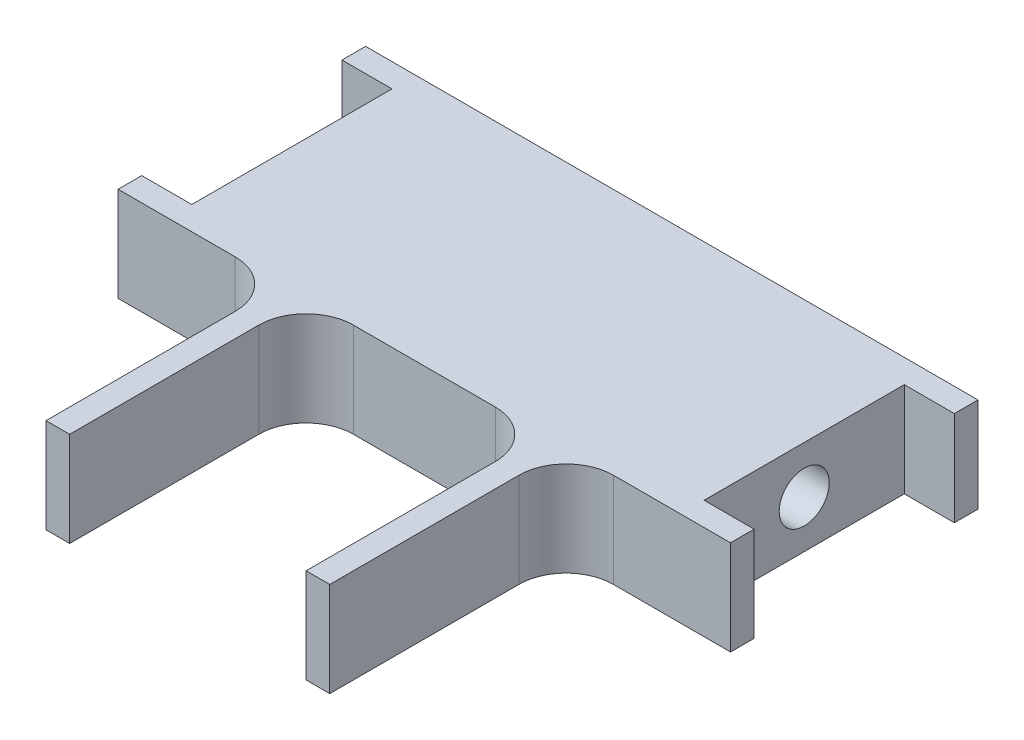
ISO-10303-21;
HEADER;
FILE_DESCRIPTION(('STEP AP214'),'2;1');
FILE_NAME('part.step','',(''),(''),'','','');
FILE_SCHEMA(('AUTOMOTIVE_DESIGN { 1 0 10303 214 1 1 1 1 }'));
ENDSEC;
DATA;
#1=APPLICATION_CONTEXT('core data for automotive mechanical design processes');
#2=APPLICATION_PROTOCOL_DEFINITION('international standard','automotive_design',2000,#1);
#3=PRODUCT_CONTEXT('',#1,'mechanical');
#4=PRODUCT('Part','Part','',(#3));
#5=PRODUCT_RELATED_PRODUCT_CATEGORY('part','',(#4));
#6=PRODUCT_DEFINITION_FORMATION('','',#4);
#7=PRODUCT_DEFINITION_CONTEXT('part definition',#1,'design');
#8=PRODUCT_DEFINITION('design','',#6,#7);
#9=PRODUCT_DEFINITION_SHAPE('','',#8);
#10=(LENGTH_UNIT() NAMED_UNIT(*) SI_UNIT(.MILLI.,.METRE.));
#11=(NAMED_UNIT(*) PLANE_ANGLE_UNIT() SI_UNIT($,.RADIAN.));
#12=(NAMED_UNIT(*) SI_UNIT($,.STERADIAN.) SOLID_ANGLE_UNIT());
#13=UNCERTAINTY_MEASURE_WITH_UNIT(LENGTH_MEASURE(1.E-05),#10,'distance_accuracy_value','');
#14=(GEOMETRIC_REPRESENTATION_CONTEXT(3) GLOBAL_UNCERTAINTY_ASSIGNED_CONTEXT((#13)) GLOBAL_UNIT_ASSIGNED_CONTEXT((#10,
#11,#12)) REPRESENTATION_CONTEXT('',''));
#15=CARTESIAN_POINT('',(0.,0.,0.));
#16=DIRECTION('',(0.,0.,1.));
#17=DIRECTION('',(1.,0.,0.));
#18=AXIS2_PLACEMENT_3D('',#15,#16,#17);
#19=CARTESIAN_POINT('',(77.7,12.,0.));
#20=DIRECTION('',(0.,0.,-1.));
#21=DIRECTION('',(-1.,0.,0.));
#22=AXIS2_PLACEMENT_3D('',#19,#20,#21);
#23=PLANE('',#22);
#24=DIRECTION('',(1.,0.,0.));
#25=VECTOR('',#24,1.);
#26=CARTESIAN_POINT('',(77.7,0.,0.));
#27=LINE('',#26,#25);
#28=CARTESIAN_POINT('',(29.85,0.,0.));
#29=VERTEX_POINT('',#28);
#30=CARTESIAN_POINT('',(47.85,0.,0.));
#31=VERTEX_POINT('',#30);
#32=EDGE_CURVE('E286',#29,#31,#27,.T.);
#33=ORIENTED_EDGE('',*,*,#32,.T.);
#34=DIRECTION('',(0.,-1.,0.));
#35=VECTOR('',#34,1.);
#36=CARTESIAN_POINT('',(47.85,12.,0.));
#37=LINE('',#36,#35);
#38=CARTESIAN_POINT('',(47.85,12.,0.));
#39=VERTEX_POINT('',#38);
#40=EDGE_CURVE('E305',#31,#39,#37,.F.);
#41=ORIENTED_EDGE('',*,*,#40,.T.);
#42=DIRECTION('',(1.,0.,0.));
#43=VECTOR('',#42,1.);
#44=CARTESIAN_POINT('',(77.7,12.,0.));
#45=LINE('',#44,#43);
#46=CARTESIAN_POINT('',(29.85,12.,0.));
#47=VERTEX_POINT('',#46);
#48=EDGE_CURVE('E255',#47,#39,#45,.T.);
#49=ORIENTED_EDGE('',*,*,#48,.F.);
#50=DIRECTION('',(0.,1.,0.));
#51=VECTOR('',#50,1.);
#52=CARTESIAN_POINT('',(29.85,0.,0.));
#53=LINE('',#52,#51);
#54=EDGE_CURVE('E283',#47,#29,#53,.F.);
#55=ORIENTED_EDGE('',*,*,#54,.T.);
#56=EDGE_LOOP('',(#33,#41,#49,#55));
#57=FACE_BOUND('',#56,.T.);
#58=ADVANCED_FACE('F32',(#57),#23,.F.);
#59=CARTESIAN_POINT('',(62.85,12.,0.));
#60=VERTEX_POINT('',#59);
#61=CARTESIAN_POINT('',(77.7,12.,0.));
#62=VERTEX_POINT('',#61);
#63=EDGE_CURVE('E246',#60,#62,#45,.T.);
#64=ORIENTED_EDGE('',*,*,#63,.F.);
#65=DIRECTION('',(0.,1.,0.));
#66=VECTOR('',#65,1.);
#67=CARTESIAN_POINT('',(62.85,0.,0.));
#68=LINE('',#67,#66);
#69=CARTESIAN_POINT('',(62.85,0.,0.));
#70=VERTEX_POINT('',#69);
#71=EDGE_CURVE('E53',#60,#70,#68,.F.);
#72=ORIENTED_EDGE('',*,*,#71,.T.);
#73=CARTESIAN_POINT('',(77.7,0.,0.));
#74=VERTEX_POINT('',#73);
#75=EDGE_CURVE('E238',#70,#74,#27,.T.);
#76=ORIENTED_EDGE('',*,*,#75,.T.);
#77=DIRECTION('',(0.,-1.,0.));
#78=VECTOR('',#77,1.);
#79=CARTESIAN_POINT('',(77.7,12.,0.));
#80=LINE('',#79,#78);
#81=EDGE_CURVE('E281',#62,#74,#80,.T.);
#82=ORIENTED_EDGE('',*,*,#81,.F.);
#83=EDGE_LOOP('',(#64,#72,#76,#82));
#84=FACE_BOUND('',#83,.T.);
#85=ADVANCED_FACE('F364',(#84),#23,.F.);
#86=CARTESIAN_POINT('',(0.,0.,0.));
#87=VERTEX_POINT('',#86);
#88=CARTESIAN_POINT('',(14.85,0.,0.));
#89=VERTEX_POINT('',#88);
#90=EDGE_CURVE('E256',#87,#89,#27,.T.);
#91=ORIENTED_EDGE('',*,*,#90,.T.);
#92=DIRECTION('',(0.,-1.,0.));
#93=VECTOR('',#92,1.);
#94=CARTESIAN_POINT('',(14.85,12.,0.));
#95=LINE('',#94,#93);
#96=CARTESIAN_POINT('',(14.85,12.,0.));
#97=VERTEX_POINT('',#96);
#98=EDGE_CURVE('E280',#89,#97,#95,.F.);
#99=ORIENTED_EDGE('',*,*,#98,.T.);
#100=CARTESIAN_POINT('',(0.,12.,0.));
#101=VERTEX_POINT('',#100);
#102=EDGE_CURVE('E251',#101,#97,#45,.T.);
#103=ORIENTED_EDGE('',*,*,#102,.F.);
#104=DIRECTION('',(0.,-1.,0.));
#105=VECTOR('',#104,1.);
#106=CARTESIAN_POINT('',(0.,12.,0.));
#107=LINE('',#106,#105);
#108=EDGE_CURVE('E339',#101,#87,#107,.T.);
#109=ORIENTED_EDGE('',*,*,#108,.T.);
#110=EDGE_LOOP('',(#91,#99,#103,#109));
#111=FACE_BOUND('',#110,.T.);
#112=ADVANCED_FACE('F336',(#111),#23,.F.);
#113=CARTESIAN_POINT('',(77.7,12.,-3.00000000000001));
#114=DIRECTION('',(-1.,0.,0.));
#115=DIRECTION('',(0.,0.,1.));
#116=AXIS2_PLACEMENT_3D('',#113,#114,#115);
#117=PLANE('',#116);
#118=DIRECTION('',(0.,0.,-1.));
#119=VECTOR('',#118,1.);
#120=CARTESIAN_POINT('',(77.7,0.,-3.00000000000001));
#121=LINE('',#120,#119);
#122=CARTESIAN_POINT('',(77.7,0.,-3.00000000000001));
#123=VERTEX_POINT('',#122);
#124=EDGE_CURVE('E295',#74,#123,#121,.T.);
#125=ORIENTED_EDGE('',*,*,#124,.T.);
#126=DIRECTION('',(0.,-1.,0.));
#127=VECTOR('',#126,1.);
#128=CARTESIAN_POINT('',(77.7,12.,-3.00000000000001));
#129=LINE('',#128,#127);
#130=CARTESIAN_POINT('',(77.7,12.,-3.00000000000001));
#131=VERTEX_POINT('',#130);
#132=EDGE_CURVE('E491',#131,#123,#129,.T.);
#133=ORIENTED_EDGE('',*,*,#132,.F.);
#134=DIRECTION('',(0.,0.,-1.));
#135=VECTOR('',#134,1.);
#136=CARTESIAN_POINT('',(77.7,12.,-3.00000000000001));
#137=LINE('',#136,#135);
#138=EDGE_CURVE('E241',#62,#131,#137,.T.);
#139=ORIENTED_EDGE('',*,*,#138,.F.);
#140=ORIENTED_EDGE('',*,*,#81,.T.);
#141=EDGE_LOOP('',(#125,#133,#139,#140));
#142=FACE_BOUND('',#141,.T.);
#143=ADVANCED_FACE('F372',(#142),#117,.F.);
#144=CARTESIAN_POINT('',(71.35,12.,-3.));
#145=DIRECTION('',(0.,0.,1.));
#146=DIRECTION('',(1.,0.,0.));
#147=AXIS2_PLACEMENT_3D('',#144,#145,#146);
#148=PLANE('',#147);
#149=DIRECTION('',(-1.,0.,0.));
#150=VECTOR('',#149,1.);
#151=CARTESIAN_POINT('',(71.35,0.,-3.));
#152=LINE('',#151,#150);
#153=CARTESIAN_POINT('',(71.35,0.,-3.));
#154=VERTEX_POINT('',#153);
#155=EDGE_CURVE('E445',#123,#154,#152,.T.);
#156=ORIENTED_EDGE('',*,*,#155,.T.);
#157=DIRECTION('',(0.,-1.,0.));
#158=VECTOR('',#157,1.);
#159=CARTESIAN_POINT('',(71.35,12.,-3.));
#160=LINE('',#159,#158);
#161=CARTESIAN_POINT('',(71.35,12.,-3.));
#162=VERTEX_POINT('',#161);
#163=EDGE_CURVE('E441',#162,#154,#160,.T.);
#164=ORIENTED_EDGE('',*,*,#163,.F.);
#165=DIRECTION('',(-1.,0.,0.));
#166=VECTOR('',#165,1.);
#167=CARTESIAN_POINT('',(71.35,12.,-3.));
#168=LINE('',#167,#166);
#169=EDGE_CURVE('E500',#131,#162,#168,.T.);
#170=ORIENTED_EDGE('',*,*,#169,.F.);
#171=ORIENTED_EDGE('',*,*,#132,.T.);
#172=EDGE_LOOP('',(#156,#164,#170,#171));
#173=FACE_BOUND('',#172,.T.);
#174=ADVANCED_FACE('F376',(#173),#148,.F.);
#175=CARTESIAN_POINT('',(71.35,12.,-28.4));
#176=DIRECTION('',(-1.,0.,0.));
#177=DIRECTION('',(0.,0.,1.));
#178=AXIS2_PLACEMENT_3D('',#175,#176,#177);
#179=PLANE('',#178);
#180=CARTESIAN_POINT('',(71.35,6.,-15.7));
#181=DIRECTION('',(-1.,0.,0.));
#182=DIRECTION('',(0.,0.,1.));
#183=AXIS2_PLACEMENT_3D('',#180,#181,#182);
#184=CIRCLE('',#183,3.175);
#185=CARTESIAN_POINT('',(71.35,6.,-12.525));
#186=VERTEX_POINT('',#185);
#187=EDGE_CURVE('E234',#186,#186,#184,.T.);
#188=ORIENTED_EDGE('',*,*,#187,.T.);
#189=EDGE_LOOP('',(#188));
#190=FACE_BOUND('',#189,.T.);
#191=DIRECTION('',(0.,0.,-1.));
#192=VECTOR('',#191,1.);
#193=CARTESIAN_POINT('',(71.35,0.,-28.4));
#194=LINE('',#193,#192);
#195=CARTESIAN_POINT('',(71.35,0.,-28.4));
#196=VERTEX_POINT('',#195);
#197=EDGE_CURVE('E435',#154,#196,#194,.T.);
#198=ORIENTED_EDGE('',*,*,#197,.T.);
#199=DIRECTION('',(0.,-1.,0.));
#200=VECTOR('',#199,1.);
#201=CARTESIAN_POINT('',(71.35,12.,-28.4));
#202=LINE('',#201,#200);
#203=CARTESIAN_POINT('',(71.35,12.,-28.4));
#204=VERTEX_POINT('',#203);
#205=EDGE_CURVE('E438',#204,#196,#202,.T.);
#206=ORIENTED_EDGE('',*,*,#205,.F.);
#207=DIRECTION('',(0.,0.,-1.));
#208=VECTOR('',#207,1.);
#209=CARTESIAN_POINT('',(71.35,12.,-28.4));
#210=LINE('',#209,#208);
#211=EDGE_CURVE('E501',#162,#204,#210,.T.);
#212=ORIENTED_EDGE('',*,*,#211,.F.);
#213=ORIENTED_EDGE('',*,*,#163,.T.);
#214=EDGE_LOOP('',(#198,#206,#212,#213));
#215=FACE_BOUND('',#214,.T.);
#216=ADVANCED_FACE('F381',(#190,#215),#179,.F.);
#217=CARTESIAN_POINT('',(77.7,12.,-28.4));
#218=DIRECTION('',(0.,0.,-1.));
#219=DIRECTION('',(-1.,0.,0.));
#220=AXIS2_PLACEMENT_3D('',#217,#218,#219);
#221=PLANE('',#220);
#222=DIRECTION('',(1.,0.,0.));
#223=VECTOR('',#222,1.);
#224=CARTESIAN_POINT('',(77.7,0.,-28.4));
#225=LINE('',#224,#223);
#226=CARTESIAN_POINT('',(77.7,0.,-28.4));
#227=VERTEX_POINT('',#226);
#228=EDGE_CURVE('E444',#196,#227,#225,.T.);
#229=ORIENTED_EDGE('',*,*,#228,.T.);
#230=DIRECTION('',(0.,-1.,0.));
#231=VECTOR('',#230,1.);
#232=CARTESIAN_POINT('',(77.7,12.,-28.4));
#233=LINE('',#232,#231);
#234=CARTESIAN_POINT('',(77.7,12.,-28.4));
#235=VERTEX_POINT('',#234);
#236=EDGE_CURVE('E450',#235,#227,#233,.T.);
#237=ORIENTED_EDGE('',*,*,#236,.F.);
#238=DIRECTION('',(1.,0.,0.));
#239=VECTOR('',#238,1.);
#240=CARTESIAN_POINT('',(77.7,12.,-28.4));
#241=LINE('',#240,#239);
#242=EDGE_CURVE('E449',#204,#235,#241,.T.);
#243=ORIENTED_EDGE('',*,*,#242,.F.);
#244=ORIENTED_EDGE('',*,*,#205,.T.);
#245=EDGE_LOOP('',(#229,#237,#243,#244));
#246=FACE_BOUND('',#245,.T.);
#247=ADVANCED_FACE('F387',(#246),#221,.F.);
#248=CARTESIAN_POINT('',(77.7,12.,-31.4));
#249=DIRECTION('',(-1.,0.,0.));
#250=DIRECTION('',(0.,0.,1.));
#251=AXIS2_PLACEMENT_3D('',#248,#249,#250);
#252=PLANE('',#251);
#253=DIRECTION('',(0.,0.,-1.));
#254=VECTOR('',#253,1.);
#255=CARTESIAN_POINT('',(77.7,0.,-31.4));
#256=LINE('',#255,#254);
#257=CARTESIAN_POINT('',(77.7,0.,-31.4));
#258=VERTEX_POINT('',#257);
#259=EDGE_CURVE('E454',#227,#258,#256,.T.);
#260=ORIENTED_EDGE('',*,*,#259,.T.);
#261=DIRECTION('',(0.,-1.,0.));
#262=VECTOR('',#261,1.);
#263=CARTESIAN_POINT('',(77.7,12.,-31.4));
#264=LINE('',#263,#262);
#265=CARTESIAN_POINT('',(77.7,12.,-31.4));
#266=VERTEX_POINT('',#265);
#267=EDGE_CURVE('E486',#266,#258,#264,.T.);
#268=ORIENTED_EDGE('',*,*,#267,.F.);
#269=DIRECTION('',(0.,0.,-1.));
#270=VECTOR('',#269,1.);
#271=CARTESIAN_POINT('',(77.7,12.,-31.4));
#272=LINE('',#271,#270);
#273=EDGE_CURVE('E505',#235,#266,#272,.T.);
#274=ORIENTED_EDGE('',*,*,#273,.F.);
#275=ORIENTED_EDGE('',*,*,#236,.T.);
#276=EDGE_LOOP('',(#260,#268,#274,#275));
#277=FACE_BOUND('',#276,.T.);
#278=ADVANCED_FACE('F391',(#277),#252,.F.);
#279=CARTESIAN_POINT('',(0.,12.,-31.4));
#280=DIRECTION('',(0.,0.,1.));
#281=DIRECTION('',(1.,0.,0.));
#282=AXIS2_PLACEMENT_3D('',#279,#280,#281);
#283=PLANE('',#282);
#284=DIRECTION('',(-1.,0.,0.));
#285=VECTOR('',#284,1.);
#286=CARTESIAN_POINT('',(0.,0.,-31.4));
#287=LINE('',#286,#285);
#288=CARTESIAN_POINT('',(0.,0.,-31.4));
#289=VERTEX_POINT('',#288);
#290=EDGE_CURVE('E456',#258,#289,#287,.T.);
#291=ORIENTED_EDGE('',*,*,#290,.T.);
#292=DIRECTION('',(0.,-1.,0.));
#293=VECTOR('',#292,1.);
#294=CARTESIAN_POINT('',(0.,12.,-31.4));
#295=LINE('',#294,#293);
#296=CARTESIAN_POINT('',(0.,12.,-31.4));
#297=VERTEX_POINT('',#296);
#298=EDGE_CURVE('E483',#297,#289,#295,.T.);
#299=ORIENTED_EDGE('',*,*,#298,.F.);
#300=DIRECTION('',(-1.,0.,0.));
#301=VECTOR('',#300,1.);
#302=CARTESIAN_POINT('',(0.,12.,-31.4));
#303=LINE('',#302,#301);
#304=EDGE_CURVE('E507',#266,#297,#303,.T.);
#305=ORIENTED_EDGE('',*,*,#304,.F.);
#306=ORIENTED_EDGE('',*,*,#267,.T.);
#307=EDGE_LOOP('',(#291,#299,#305,#306));
#308=FACE_BOUND('',#307,.T.);
#309=ADVANCED_FACE('F395',(#308),#283,.F.);
#310=CARTESIAN_POINT('',(0.,12.,-28.4));
#311=DIRECTION('',(1.,0.,0.));
#312=DIRECTION('',(0.,0.,-1.));
#313=AXIS2_PLACEMENT_3D('',#310,#311,#312);
#314=PLANE('',#313);
#315=DIRECTION('',(0.,0.,1.));
#316=VECTOR('',#315,1.);
#317=CARTESIAN_POINT('',(0.,0.,-28.4));
#318=LINE('',#317,#316);
#319=CARTESIAN_POINT('',(0.,0.,-28.4));
#320=VERTEX_POINT('',#319);
#321=EDGE_CURVE('E460',#289,#320,#318,.T.);
#322=ORIENTED_EDGE('',*,*,#321,.T.);
#323=DIRECTION('',(0.,-1.,0.));
#324=VECTOR('',#323,1.);
#325=CARTESIAN_POINT('',(0.,12.,-28.4));
#326=LINE('',#325,#324);
#327=CARTESIAN_POINT('',(0.,12.,-28.4));
#328=VERTEX_POINT('',#327);
#329=EDGE_CURVE('E480',#328,#320,#326,.T.);
#330=ORIENTED_EDGE('',*,*,#329,.F.);
#331=DIRECTION('',(0.,0.,1.));
#332=VECTOR('',#331,1.);
#333=CARTESIAN_POINT('',(0.,12.,-28.4));
#334=LINE('',#333,#332);
#335=EDGE_CURVE('E509',#297,#328,#334,.T.);
#336=ORIENTED_EDGE('',*,*,#335,.F.);
#337=ORIENTED_EDGE('',*,*,#298,.T.);
#338=EDGE_LOOP('',(#322,#330,#336,#337));
#339=FACE_BOUND('',#338,.T.);
#340=ADVANCED_FACE('F399',(#339),#314,.F.);
#341=CARTESIAN_POINT('',(6.34999999999999,12.,-28.4));
#342=DIRECTION('',(0.,0.,-1.));
#343=DIRECTION('',(-1.,0.,0.));
#344=AXIS2_PLACEMENT_3D('',#341,#342,#343);
#345=PLANE('',#344);
#346=DIRECTION('',(1.,0.,0.));
#347=VECTOR('',#346,1.);
#348=CARTESIAN_POINT('',(6.34999999999999,0.,-28.4));
#349=LINE('',#348,#347);
#350=CARTESIAN_POINT('',(6.34999999999999,0.,-28.4));
#351=VERTEX_POINT('',#350);
#352=EDGE_CURVE('E462',#320,#351,#349,.T.);
#353=ORIENTED_EDGE('',*,*,#352,.T.);
#354=DIRECTION('',(0.,-1.,0.));
#355=VECTOR('',#354,1.);
#356=CARTESIAN_POINT('',(6.34999999999999,12.,-28.4));
#357=LINE('',#356,#355);
#358=CARTESIAN_POINT('',(6.34999999999999,12.,-28.4));
#359=VERTEX_POINT('',#358);
#360=EDGE_CURVE('E477',#359,#351,#357,.T.);
#361=ORIENTED_EDGE('',*,*,#360,.F.);
#362=DIRECTION('',(1.,0.,0.));
#363=VECTOR('',#362,1.);
#364=CARTESIAN_POINT('',(6.34999999999999,12.,-28.4));
#365=LINE('',#364,#363);
#366=EDGE_CURVE('E511',#328,#359,#365,.T.);
#367=ORIENTED_EDGE('',*,*,#366,.F.);
#368=ORIENTED_EDGE('',*,*,#329,.T.);
#369=EDGE_LOOP('',(#353,#361,#367,#368));
#370=FACE_BOUND('',#369,.T.);
#371=ADVANCED_FACE('F403',(#370),#345,.F.);
#372=CARTESIAN_POINT('',(6.35,12.,-3.00000000000003));
#373=DIRECTION('',(1.,0.,0.));
#374=DIRECTION('',(0.,0.,-1.));
#375=AXIS2_PLACEMENT_3D('',#372,#373,#374);
#376=PLANE('',#375);
#377=CARTESIAN_POINT('',(6.35,6.,-15.7));
#378=DIRECTION('',(-1.,0.,0.));
#379=DIRECTION('',(0.,0.,1.));
#380=AXIS2_PLACEMENT_3D('',#377,#378,#379);
#381=CIRCLE('',#380,3.175);
#382=CARTESIAN_POINT('',(6.35,6.,-12.525));
#383=VERTEX_POINT('',#382);
#384=EDGE_CURVE('E231',#383,#383,#381,.T.);
#385=ORIENTED_EDGE('',*,*,#384,.F.);
#386=EDGE_LOOP('',(#385));
#387=FACE_BOUND('',#386,.T.);
#388=DIRECTION('',(0.,0.,1.));
#389=VECTOR('',#388,1.);
#390=CARTESIAN_POINT('',(6.35,0.,-3.00000000000003));
#391=LINE('',#390,#389);
#392=CARTESIAN_POINT('',(6.35,0.,-3.00000000000003));
#393=VERTEX_POINT('',#392);
#394=EDGE_CURVE('E464',#351,#393,#391,.T.);
#395=ORIENTED_EDGE('',*,*,#394,.T.);
#396=DIRECTION('',(0.,-1.,0.));
#397=VECTOR('',#396,1.);
#398=CARTESIAN_POINT('',(6.35,12.,-3.00000000000003));
#399=LINE('',#398,#397);
#400=CARTESIAN_POINT('',(6.35,12.,-3.00000000000003));
#401=VERTEX_POINT('',#400);
#402=EDGE_CURVE('E474',#401,#393,#399,.T.);
#403=ORIENTED_EDGE('',*,*,#402,.F.);
#404=DIRECTION('',(0.,0.,1.));
#405=VECTOR('',#404,1.);
#406=CARTESIAN_POINT('',(6.35,12.,-3.00000000000003));
#407=LINE('',#406,#405);
#408=EDGE_CURVE('E513',#359,#401,#407,.T.);
#409=ORIENTED_EDGE('',*,*,#408,.F.);
#410=ORIENTED_EDGE('',*,*,#360,.T.);
#411=EDGE_LOOP('',(#395,#403,#409,#410));
#412=FACE_BOUND('',#411,.T.);
#413=ADVANCED_FACE('F407',(#387,#412),#376,.F.);
#414=CARTESIAN_POINT('',(0.,12.,-2.99999999999999));
#415=DIRECTION('',(0.,0.,1.));
#416=DIRECTION('',(1.,0.,0.));
#417=AXIS2_PLACEMENT_3D('',#414,#415,#416);
#418=PLANE('',#417);
#419=DIRECTION('',(-1.,0.,0.));
#420=VECTOR('',#419,1.);
#421=CARTESIAN_POINT('',(0.,0.,-2.99999999999999));
#422=LINE('',#421,#420);
#423=CARTESIAN_POINT('',(0.,0.,-2.99999999999999));
#424=VERTEX_POINT('',#423);
#425=EDGE_CURVE('E466',#393,#424,#422,.T.);
#426=ORIENTED_EDGE('',*,*,#425,.T.);
#427=DIRECTION('',(0.,-1.,0.));
#428=VECTOR('',#427,1.);
#429=CARTESIAN_POINT('',(0.,12.,-2.99999999999999));
#430=LINE('',#429,#428);
#431=CARTESIAN_POINT('',(0.,12.,-2.99999999999999));
#432=VERTEX_POINT('',#431);
#433=EDGE_CURVE('E471',#432,#424,#430,.T.);
#434=ORIENTED_EDGE('',*,*,#433,.F.);
#435=DIRECTION('',(-1.,0.,0.));
#436=VECTOR('',#435,1.);
#437=CARTESIAN_POINT('',(0.,12.,-2.99999999999999));
#438=LINE('',#437,#436);
#439=EDGE_CURVE('E514',#401,#432,#438,.T.);
#440=ORIENTED_EDGE('',*,*,#439,.F.);
#441=ORIENTED_EDGE('',*,*,#402,.T.);
#442=EDGE_LOOP('',(#426,#434,#440,#441));
#443=FACE_BOUND('',#442,.T.);
#444=ADVANCED_FACE('F411',(#443),#418,.F.);
#445=CARTESIAN_POINT('',(0.,12.,0.));
#446=DIRECTION('',(1.,0.,0.));
#447=DIRECTION('',(0.,0.,-1.));
#448=AXIS2_PLACEMENT_3D('',#445,#446,#447);
#449=PLANE('',#448);
#450=DIRECTION('',(0.,0.,1.));
#451=VECTOR('',#450,1.);
#452=CARTESIAN_POINT('',(0.,0.,0.));
#453=LINE('',#452,#451);
#454=EDGE_CURVE('E468',#424,#87,#453,.T.);
#455=ORIENTED_EDGE('',*,*,#454,.T.);
#456=ORIENTED_EDGE('',*,*,#108,.F.);
#457=DIRECTION('',(0.,0.,1.));
#458=VECTOR('',#457,1.);
#459=CARTESIAN_POINT('',(0.,12.,0.));
#460=LINE('',#459,#458);
#461=EDGE_CURVE('E293',#432,#101,#460,.T.);
#462=ORIENTED_EDGE('',*,*,#461,.F.);
#463=ORIENTED_EDGE('',*,*,#433,.T.);
#464=EDGE_LOOP('',(#455,#456,#462,#463));
#465=FACE_BOUND('',#464,.T.);
#466=ADVANCED_FACE('F415',(#465),#449,.F.);
#467=CARTESIAN_POINT('',(0.,12.,0.));
#468=DIRECTION('',(0.,-1.,0.));
#469=DIRECTION('',(0.,0.,-1.));
#470=AXIS2_PLACEMENT_3D('',#467,#468,#469);
#471=PLANE('',#470);
#472=ORIENTED_EDGE('',*,*,#102,.T.);
#473=CARTESIAN_POINT('',(14.85,12.,6.));
#474=DIRECTION('',(0.,-1.,0.));
#475=DIRECTION('',(0.,0.,-1.));
#476=AXIS2_PLACEMENT_3D('',#473,#474,#475);
#477=CIRCLE('',#476,6.);
#478=CARTESIAN_POINT('',(20.85,12.,6.));
#479=VERTEX_POINT('',#478);
#480=EDGE_CURVE('E325',#97,#479,#477,.T.);
#481=ORIENTED_EDGE('',*,*,#480,.T.);
#482=DIRECTION('',(0.,0.,-1.));
#483=VECTOR('',#482,1.);
#484=CARTESIAN_POINT('',(20.85,12.,30.));
#485=LINE('',#484,#483);
#486=CARTESIAN_POINT('',(20.85,12.,30.));
#487=VERTEX_POINT('',#486);
#488=EDGE_CURVE('E230',#487,#479,#485,.T.);
#489=ORIENTED_EDGE('',*,*,#488,.F.);
#490=DIRECTION('',(-1.,0.,0.));
#491=VECTOR('',#490,1.);
#492=CARTESIAN_POINT('',(20.85,12.,30.));
#493=LINE('',#492,#491);
#494=CARTESIAN_POINT('',(23.85,12.,30.));
#495=VERTEX_POINT('',#494);
#496=EDGE_CURVE('E228',#495,#487,#493,.T.);
#497=ORIENTED_EDGE('',*,*,#496,.F.);
#498=DIRECTION('',(0.,0.,-1.));
#499=VECTOR('',#498,1.);
#500=CARTESIAN_POINT('',(23.85,12.,30.));
#501=LINE('',#500,#499);
#502=CARTESIAN_POINT('',(23.85,12.,6.));
#503=VERTEX_POINT('',#502);
#504=EDGE_CURVE('E259',#495,#503,#501,.T.);
#505=ORIENTED_EDGE('',*,*,#504,.T.);
#506=CARTESIAN_POINT('',(29.85,12.,6.));
#507=DIRECTION('',(0.,-1.,0.));
#508=DIRECTION('',(0.,0.,-1.));
#509=AXIS2_PLACEMENT_3D('',#506,#507,#508);
#510=CIRCLE('',#509,6.);
#511=EDGE_CURVE('E318',#503,#47,#510,.T.);
#512=ORIENTED_EDGE('',*,*,#511,.T.);
#513=ORIENTED_EDGE('',*,*,#48,.T.);
#514=CARTESIAN_POINT('',(47.85,12.,5.99999999999999));
#515=DIRECTION('',(0.,-1.,0.));
#516=DIRECTION('',(0.,0.,-1.));
#517=AXIS2_PLACEMENT_3D('',#514,#515,#516);
#518=CIRCLE('',#517,6.);
#519=CARTESIAN_POINT('',(53.85,12.,5.99999999999999));
#520=VERTEX_POINT('',#519);
#521=EDGE_CURVE('E320',#39,#520,#518,.T.);
#522=ORIENTED_EDGE('',*,*,#521,.T.);
#523=DIRECTION('',(0.,0.,-1.));
#524=VECTOR('',#523,1.);
#525=CARTESIAN_POINT('',(53.85,12.,30.));
#526=LINE('',#525,#524);
#527=CARTESIAN_POINT('',(53.85,12.,30.));
#528=VERTEX_POINT('',#527);
#529=EDGE_CURVE('E538',#528,#520,#526,.T.);
#530=ORIENTED_EDGE('',*,*,#529,.F.);
#531=DIRECTION('',(-1.,0.,0.));
#532=VECTOR('',#531,1.);
#533=CARTESIAN_POINT('',(53.85,12.,30.));
#534=LINE('',#533,#532);
#535=CARTESIAN_POINT('',(56.85,12.,30.));
#536=VERTEX_POINT('',#535);
#537=EDGE_CURVE('E207',#536,#528,#534,.T.);
#538=ORIENTED_EDGE('',*,*,#537,.F.);
#539=DIRECTION('',(0.,0.,-1.));
#540=VECTOR('',#539,1.);
#541=CARTESIAN_POINT('',(56.85,12.,30.));
#542=LINE('',#541,#540);
#543=CARTESIAN_POINT('',(56.85,12.,5.99999999999999));
#544=VERTEX_POINT('',#543);
#545=EDGE_CURVE('E221',#536,#544,#542,.T.);
#546=ORIENTED_EDGE('',*,*,#545,.T.);
#547=CARTESIAN_POINT('',(62.85,12.,5.99999999999999));
#548=DIRECTION('',(0.,-1.,0.));
#549=DIRECTION('',(0.,0.,-1.));
#550=AXIS2_PLACEMENT_3D('',#547,#548,#549);
#551=CIRCLE('',#550,6.);
#552=EDGE_CURVE('E40',#544,#60,#551,.T.);
#553=ORIENTED_EDGE('',*,*,#552,.T.);
#554=ORIENTED_EDGE('',*,*,#63,.T.);
#555=ORIENTED_EDGE('',*,*,#138,.T.);
#556=ORIENTED_EDGE('',*,*,#169,.T.);
#557=ORIENTED_EDGE('',*,*,#211,.T.);
#558=ORIENTED_EDGE('',*,*,#242,.T.);
#559=ORIENTED_EDGE('',*,*,#273,.T.);
#560=ORIENTED_EDGE('',*,*,#304,.T.);
#561=ORIENTED_EDGE('',*,*,#335,.T.);
#562=ORIENTED_EDGE('',*,*,#366,.T.);
#563=ORIENTED_EDGE('',*,*,#408,.T.);
#564=ORIENTED_EDGE('',*,*,#439,.T.);
#565=ORIENTED_EDGE('',*,*,#461,.T.);
#566=EDGE_LOOP('',(#472,#481,#489,#497,#505,#512,#513,#522,#530,#538,#546,#553,#554,#555,#556,
#557,#558,#559,#560,#561,#562,#563,#564,#565));
#567=FACE_BOUND('',#566,.T.);
#568=ADVANCED_FACE('F343',(#567),#471,.F.);
#569=CARTESIAN_POINT('',(0.,0.,0.));
#570=DIRECTION('',(0.,-1.,0.));
#571=DIRECTION('',(0.,0.,-1.));
#572=AXIS2_PLACEMENT_3D('',#569,#570,#571);
#573=PLANE('',#572);
#574=ORIENTED_EDGE('',*,*,#90,.F.);
#575=ORIENTED_EDGE('',*,*,#454,.F.);
#576=ORIENTED_EDGE('',*,*,#425,.F.);
#577=ORIENTED_EDGE('',*,*,#394,.F.);
#578=ORIENTED_EDGE('',*,*,#352,.F.);
#579=ORIENTED_EDGE('',*,*,#321,.F.);
#580=ORIENTED_EDGE('',*,*,#290,.F.);
#581=ORIENTED_EDGE('',*,*,#259,.F.);
#582=ORIENTED_EDGE('',*,*,#228,.F.);
#583=ORIENTED_EDGE('',*,*,#197,.F.);
#584=ORIENTED_EDGE('',*,*,#155,.F.);
#585=ORIENTED_EDGE('',*,*,#124,.F.);
#586=ORIENTED_EDGE('',*,*,#75,.F.);
#587=CARTESIAN_POINT('',(62.85,0.,5.99999999999999));
#588=DIRECTION('',(0.,-1.,0.));
#589=DIRECTION('',(0.,0.,-1.));
#590=AXIS2_PLACEMENT_3D('',#587,#588,#589);
#591=CIRCLE('',#590,6.);
#592=CARTESIAN_POINT('',(56.85,0.,5.99999999999999));
#593=VERTEX_POINT('',#592);
#594=EDGE_CURVE('E11',#70,#593,#591,.F.);
#595=ORIENTED_EDGE('',*,*,#594,.T.);
#596=DIRECTION('',(0.,0.,-1.));
#597=VECTOR('',#596,1.);
#598=CARTESIAN_POINT('',(56.85,0.,30.));
#599=LINE('',#598,#597);
#600=CARTESIAN_POINT('',(56.85,0.,30.));
#601=VERTEX_POINT('',#600);
#602=EDGE_CURVE('E198',#601,#593,#599,.T.);
#603=ORIENTED_EDGE('',*,*,#602,.F.);
#604=DIRECTION('',(1.,0.,0.));
#605=VECTOR('',#604,1.);
#606=CARTESIAN_POINT('',(53.85,0.,30.));
#607=LINE('',#606,#605);
#608=CARTESIAN_POINT('',(53.85,0.,30.));
#609=VERTEX_POINT('',#608);
#610=EDGE_CURVE('E191',#609,#601,#607,.T.);
#611=ORIENTED_EDGE('',*,*,#610,.F.);
#612=DIRECTION('',(0.,0.,-1.));
#613=VECTOR('',#612,1.);
#614=CARTESIAN_POINT('',(53.85,0.,30.));
#615=LINE('',#614,#613);
#616=CARTESIAN_POINT('',(53.85,0.,5.99999999999999));
#617=VERTEX_POINT('',#616);
#618=EDGE_CURVE('E196',#609,#617,#615,.T.);
#619=ORIENTED_EDGE('',*,*,#618,.T.);
#620=CARTESIAN_POINT('',(47.85,0.,5.99999999999999));
#621=DIRECTION('',(0.,-1.,0.));
#622=DIRECTION('',(0.,0.,-1.));
#623=AXIS2_PLACEMENT_3D('',#620,#621,#622);
#624=CIRCLE('',#623,6.);
#625=EDGE_CURVE('E315',#617,#31,#624,.F.);
#626=ORIENTED_EDGE('',*,*,#625,.T.);
#627=ORIENTED_EDGE('',*,*,#32,.F.);
#628=CARTESIAN_POINT('',(29.85,0.,6.));
#629=DIRECTION('',(0.,-1.,0.));
#630=DIRECTION('',(0.,0.,-1.));
#631=AXIS2_PLACEMENT_3D('',#628,#629,#630);
#632=CIRCLE('',#631,6.);
#633=CARTESIAN_POINT('',(23.85,0.,6.));
#634=VERTEX_POINT('',#633);
#635=EDGE_CURVE('E314',#29,#634,#632,.F.);
#636=ORIENTED_EDGE('',*,*,#635,.T.);
#637=DIRECTION('',(0.,0.,-1.));
#638=VECTOR('',#637,1.);
#639=CARTESIAN_POINT('',(23.85,0.,30.));
#640=LINE('',#639,#638);
#641=CARTESIAN_POINT('',(23.85,0.,30.));
#642=VERTEX_POINT('',#641);
#643=EDGE_CURVE('E262',#642,#634,#640,.T.);
#644=ORIENTED_EDGE('',*,*,#643,.F.);
#645=DIRECTION('',(1.,0.,0.));
#646=VECTOR('',#645,1.);
#647=CARTESIAN_POINT('',(20.85,0.,30.));
#648=LINE('',#647,#646);
#649=CARTESIAN_POINT('',(20.85,0.,30.));
#650=VERTEX_POINT('',#649);
#651=EDGE_CURVE('E219',#650,#642,#648,.T.);
#652=ORIENTED_EDGE('',*,*,#651,.F.);
#653=DIRECTION('',(0.,0.,-1.));
#654=VECTOR('',#653,1.);
#655=CARTESIAN_POINT('',(20.85,0.,30.));
#656=LINE('',#655,#654);
#657=CARTESIAN_POINT('',(20.85,0.,6.));
#658=VERTEX_POINT('',#657);
#659=EDGE_CURVE('E235',#650,#658,#656,.T.);
#660=ORIENTED_EDGE('',*,*,#659,.T.);
#661=CARTESIAN_POINT('',(14.85,0.,6.));
#662=DIRECTION('',(0.,-1.,0.));
#663=DIRECTION('',(0.,0.,-1.));
#664=AXIS2_PLACEMENT_3D('',#661,#662,#663);
#665=CIRCLE('',#664,6.);
#666=EDGE_CURVE('E327',#658,#89,#665,.F.);
#667=ORIENTED_EDGE('',*,*,#666,.T.);
#668=EDGE_LOOP('',(#574,#575,#576,#577,#578,#579,#580,#581,#582,#583,#584,#585,#586,#595,#603,
#611,#619,#626,#627,#636,#644,#652,#660,#667));
#669=FACE_BOUND('',#668,.T.);
#670=ADVANCED_FACE('F194',(#669),#573,.T.);
#671=CARTESIAN_POINT('',(77.7,6.,-15.7));
#672=DIRECTION('',(-1.,0.,0.));
#673=DIRECTION('',(0.,0.,1.));
#674=AXIS2_PLACEMENT_3D('',#671,#672,#673);
#675=CYLINDRICAL_SURFACE('',#674,3.175);
#676=ORIENTED_EDGE('',*,*,#384,.T.);
#677=EDGE_LOOP('',(#676));
#678=FACE_BOUND('',#677,.T.);
#679=ORIENTED_EDGE('',*,*,#187,.F.);
#680=EDGE_LOOP('',(#679));
#681=FACE_BOUND('',#680,.T.);
#682=ADVANCED_FACE('F361',(#678,#681),#675,.F.);
#683=CARTESIAN_POINT('',(20.85,0.,30.));
#684=DIRECTION('',(1.,0.,0.));
#685=DIRECTION('',(0.,0.,-1.));
#686=AXIS2_PLACEMENT_3D('',#683,#684,#685);
#687=PLANE('',#686);
#688=ORIENTED_EDGE('',*,*,#488,.T.);
#689=DIRECTION('',(0.,-1.,0.));
#690=VECTOR('',#689,1.);
#691=CARTESIAN_POINT('',(20.85,0.,6.));
#692=LINE('',#691,#690);
#693=EDGE_CURVE('E277',#479,#658,#692,.T.);
#694=ORIENTED_EDGE('',*,*,#693,.T.);
#695=ORIENTED_EDGE('',*,*,#659,.F.);
#696=DIRECTION('',(0.,-1.,0.));
#697=VECTOR('',#696,1.);
#698=CARTESIAN_POINT('',(20.85,0.,30.));
#699=LINE('',#698,#697);
#700=EDGE_CURVE('E216',#487,#650,#699,.T.);
#701=ORIENTED_EDGE('',*,*,#700,.F.);
#702=EDGE_LOOP('',(#688,#694,#695,#701));
#703=FACE_BOUND('',#702,.T.);
#704=ADVANCED_FACE('F347',(#703),#687,.F.);
#705=CARTESIAN_POINT('',(23.85,0.,30.));
#706=DIRECTION('',(-1.,0.,0.));
#707=DIRECTION('',(0.,0.,1.));
#708=AXIS2_PLACEMENT_3D('',#705,#706,#707);
#709=PLANE('',#708);
#710=ORIENTED_EDGE('',*,*,#643,.T.);
#711=DIRECTION('',(0.,1.,0.));
#712=VECTOR('',#711,1.);
#713=CARTESIAN_POINT('',(23.85,12.,6.));
#714=LINE('',#713,#712);
#715=EDGE_CURVE('E303',#634,#503,#714,.T.);
#716=ORIENTED_EDGE('',*,*,#715,.T.);
#717=ORIENTED_EDGE('',*,*,#504,.F.);
#718=DIRECTION('',(0.,1.,0.));
#719=VECTOR('',#718,1.);
#720=CARTESIAN_POINT('',(23.85,0.,30.));
#721=LINE('',#720,#719);
#722=EDGE_CURVE('E226',#642,#495,#721,.T.);
#723=ORIENTED_EDGE('',*,*,#722,.F.);
#724=EDGE_LOOP('',(#710,#716,#717,#723));
#725=FACE_BOUND('',#724,.T.);
#726=ADVANCED_FACE('F353',(#725),#709,.F.);
#727=CARTESIAN_POINT('',(0.,0.,30.));
#728=DIRECTION('',(0.,0.,-1.));
#729=DIRECTION('',(-1.,0.,0.));
#730=AXIS2_PLACEMENT_3D('',#727,#728,#729);
#731=PLANE('',#730);
#732=ORIENTED_EDGE('',*,*,#700,.T.);
#733=ORIENTED_EDGE('',*,*,#651,.T.);
#734=ORIENTED_EDGE('',*,*,#722,.T.);
#735=ORIENTED_EDGE('',*,*,#496,.T.);
#736=EDGE_LOOP('',(#732,#733,#734,#735));
#737=FACE_BOUND('',#736,.T.);
#738=ADVANCED_FACE('F349',(#737),#731,.F.);
#739=CARTESIAN_POINT('',(53.85,0.,30.));
#740=DIRECTION('',(1.,0.,0.));
#741=DIRECTION('',(0.,0.,-1.));
#742=AXIS2_PLACEMENT_3D('',#739,#740,#741);
#743=PLANE('',#742);
#744=ORIENTED_EDGE('',*,*,#529,.T.);
#745=DIRECTION('',(0.,-1.,0.));
#746=VECTOR('',#745,1.);
#747=CARTESIAN_POINT('',(53.85,0.,5.99999999999999));
#748=LINE('',#747,#746);
#749=EDGE_CURVE('E215',#520,#617,#748,.T.);
#750=ORIENTED_EDGE('',*,*,#749,.T.);
#751=ORIENTED_EDGE('',*,*,#618,.F.);
#752=DIRECTION('',(0.,-1.,0.));
#753=VECTOR('',#752,1.);
#754=CARTESIAN_POINT('',(53.85,0.,30.));
#755=LINE('',#754,#753);
#756=EDGE_CURVE('E202',#528,#609,#755,.T.);
#757=ORIENTED_EDGE('',*,*,#756,.F.);
#758=EDGE_LOOP('',(#744,#750,#751,#757));
#759=FACE_BOUND('',#758,.T.);
#760=ADVANCED_FACE('F213',(#759),#743,.F.);
#761=CARTESIAN_POINT('',(56.85,0.,30.));
#762=DIRECTION('',(-1.,0.,0.));
#763=DIRECTION('',(0.,0.,1.));
#764=AXIS2_PLACEMENT_3D('',#761,#762,#763);
#765=PLANE('',#764);
#766=ORIENTED_EDGE('',*,*,#602,.T.);
#767=DIRECTION('',(0.,1.,0.));
#768=VECTOR('',#767,1.);
#769=CARTESIAN_POINT('',(56.85,12.,5.99999999999999));
#770=LINE('',#769,#768);
#771=EDGE_CURVE('E300',#593,#544,#770,.T.);
#772=ORIENTED_EDGE('',*,*,#771,.T.);
#773=ORIENTED_EDGE('',*,*,#545,.F.);
#774=DIRECTION('',(0.,1.,0.));
#775=VECTOR('',#774,1.);
#776=CARTESIAN_POINT('',(56.85,0.,30.));
#777=LINE('',#776,#775);
#778=EDGE_CURVE('E201',#601,#536,#777,.T.);
#779=ORIENTED_EDGE('',*,*,#778,.F.);
#780=EDGE_LOOP('',(#766,#772,#773,#779));
#781=FACE_BOUND('',#780,.T.);
#782=ADVANCED_FACE('F537',(#781),#765,.F.);
#783=CARTESIAN_POINT('',(0.,0.,30.));
#784=DIRECTION('',(0.,0.,-1.));
#785=DIRECTION('',(-1.,0.,0.));
#786=AXIS2_PLACEMENT_3D('',#783,#784,#785);
#787=PLANE('',#786);
#788=ORIENTED_EDGE('',*,*,#756,.T.);
#789=ORIENTED_EDGE('',*,*,#610,.T.);
#790=ORIENTED_EDGE('',*,*,#778,.T.);
#791=ORIENTED_EDGE('',*,*,#537,.T.);
#792=EDGE_LOOP('',(#788,#789,#790,#791));
#793=FACE_BOUND('',#792,.T.);
#794=ADVANCED_FACE('F205',(#793),#787,.F.);
#795=CARTESIAN_POINT('',(14.85,0.,6.));
#796=DIRECTION('',(0.,1.,0.));
#797=DIRECTION('',(0.,0.,1.));
#798=AXIS2_PLACEMENT_3D('',#795,#796,#797);
#799=CYLINDRICAL_SURFACE('',#798,6.);
#800=ORIENTED_EDGE('',*,*,#480,.F.);
#801=ORIENTED_EDGE('',*,*,#98,.F.);
#802=ORIENTED_EDGE('',*,*,#666,.F.);
#803=ORIENTED_EDGE('',*,*,#693,.F.);
#804=EDGE_LOOP('',(#800,#801,#802,#803));
#805=FACE_BOUND('',#804,.T.);
#806=ADVANCED_FACE('F341',(#805),#799,.F.);
#807=CARTESIAN_POINT('',(47.85,0.,5.99999999999999));
#808=DIRECTION('',(0.,1.,0.));
#809=DIRECTION('',(0.,0.,1.));
#810=AXIS2_PLACEMENT_3D('',#807,#808,#809);
#811=CYLINDRICAL_SURFACE('',#810,6.);
#812=ORIENTED_EDGE('',*,*,#521,.F.);
#813=ORIENTED_EDGE('',*,*,#40,.F.);
#814=ORIENTED_EDGE('',*,*,#625,.F.);
#815=ORIENTED_EDGE('',*,*,#749,.F.);
#816=EDGE_LOOP('',(#812,#813,#814,#815));
#817=FACE_BOUND('',#816,.T.);
#818=ADVANCED_FACE('F544',(#817),#811,.F.);
#819=CARTESIAN_POINT('',(29.85,0.,6.));
#820=DIRECTION('',(0.,-1.,0.));
#821=DIRECTION('',(0.,0.,-1.));
#822=AXIS2_PLACEMENT_3D('',#819,#820,#821);
#823=CYLINDRICAL_SURFACE('',#822,6.);
#824=ORIENTED_EDGE('',*,*,#635,.F.);
#825=ORIENTED_EDGE('',*,*,#54,.F.);
#826=ORIENTED_EDGE('',*,*,#511,.F.);
#827=ORIENTED_EDGE('',*,*,#715,.F.);
#828=EDGE_LOOP('',(#824,#825,#826,#827));
#829=FACE_BOUND('',#828,.T.);
#830=ADVANCED_FACE('F317',(#829),#823,.F.);
#831=CARTESIAN_POINT('',(62.85,0.,5.99999999999999));
#832=DIRECTION('',(0.,-1.,0.));
#833=DIRECTION('',(0.,0.,-1.));
#834=AXIS2_PLACEMENT_3D('',#831,#832,#833);
#835=CYLINDRICAL_SURFACE('',#834,6.);
#836=ORIENTED_EDGE('',*,*,#594,.F.);
#837=ORIENTED_EDGE('',*,*,#71,.F.);
#838=ORIENTED_EDGE('',*,*,#552,.F.);
#839=ORIENTED_EDGE('',*,*,#771,.F.);
#840=EDGE_LOOP('',(#836,#837,#838,#839));
#841=FACE_BOUND('',#840,.T.);
#842=ADVANCED_FACE('F34',(#841),#835,.F.);
#843=CLOSED_SHELL('',(#58,#85,#112,#143,#174,#216,#247,#278,#309,#340,#371,#413,#444,#466,#568,
#670,#682,#704,#726,#738,#760,#782,#794,#806,#818,#830,#842));
#844=MANIFOLD_SOLID_BREP('B2',#843);
#845=ADVANCED_BREP_SHAPE_REPRESENTATION('',(#18,#844),#14);
#846=SHAPE_DEFINITION_REPRESENTATION(#9,#845);
ENDSEC;
END-ISO-10303-21;
